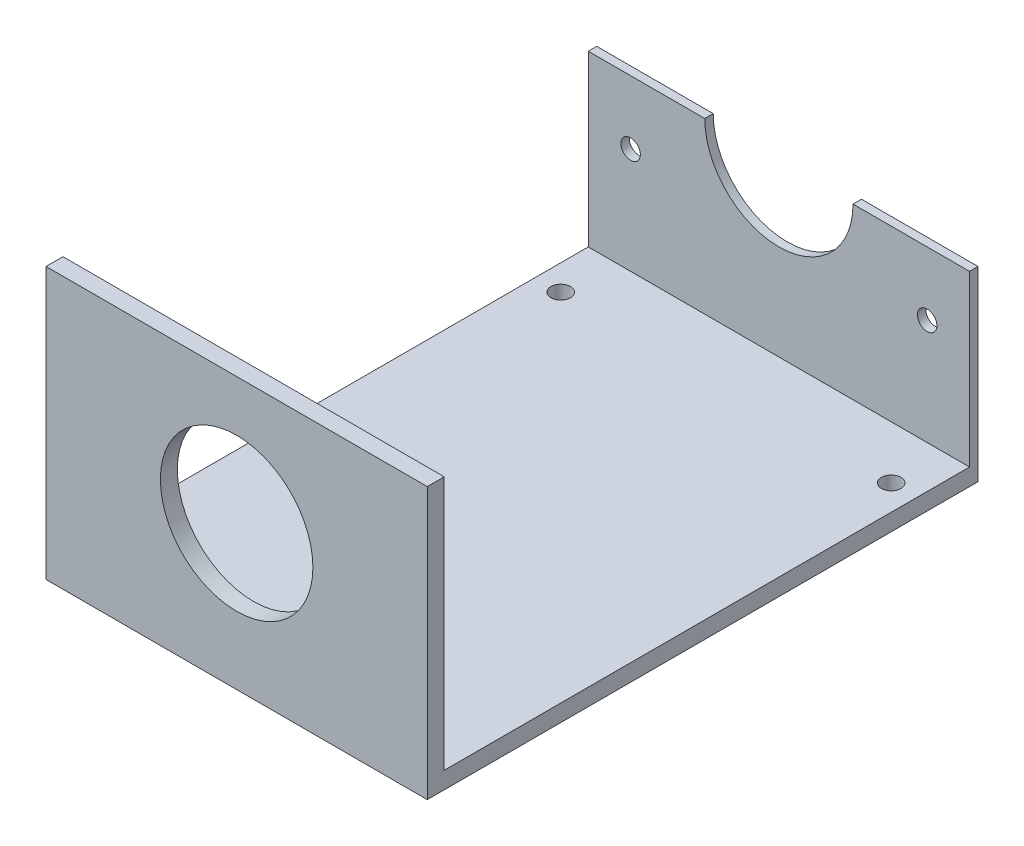
ISO-10303-21;
HEADER;
FILE_DESCRIPTION(('STEP AP214'),'2;1');
FILE_NAME('part.step','',(''),(''),'','','');
FILE_SCHEMA(('AUTOMOTIVE_DESIGN { 1 0 10303 214 1 1 1 1 }'));
ENDSEC;
DATA;
#1=APPLICATION_CONTEXT('core data for automotive mechanical design processes');
#2=APPLICATION_PROTOCOL_DEFINITION('international standard','automotive_design',2000,#1);
#3=PRODUCT_CONTEXT('',#1,'mechanical');
#4=PRODUCT('Part','Part','',(#3));
#5=PRODUCT_RELATED_PRODUCT_CATEGORY('part','',(#4));
#6=PRODUCT_DEFINITION_FORMATION('','',#4);
#7=PRODUCT_DEFINITION_CONTEXT('part definition',#1,'design');
#8=PRODUCT_DEFINITION('design','',#6,#7);
#9=PRODUCT_DEFINITION_SHAPE('','',#8);
#10=(LENGTH_UNIT() NAMED_UNIT(*) SI_UNIT(.MILLI.,.METRE.));
#11=(NAMED_UNIT(*) PLANE_ANGLE_UNIT() SI_UNIT($,.RADIAN.));
#12=(NAMED_UNIT(*) SI_UNIT($,.STERADIAN.) SOLID_ANGLE_UNIT());
#13=UNCERTAINTY_MEASURE_WITH_UNIT(LENGTH_MEASURE(1.E-05),#10,'distance_accuracy_value','');
#14=(GEOMETRIC_REPRESENTATION_CONTEXT(3) GLOBAL_UNCERTAINTY_ASSIGNED_CONTEXT((#13)) GLOBAL_UNIT_ASSIGNED_CONTEXT((#10,
#11,#12)) REPRESENTATION_CONTEXT('',''));
#15=CARTESIAN_POINT('',(0.,0.,0.));
#16=DIRECTION('',(0.,0.,1.));
#17=DIRECTION('',(1.,0.,0.));
#18=AXIS2_PLACEMENT_3D('',#15,#16,#17);
#19=CARTESIAN_POINT('',(0.,0.,128.));
#20=DIRECTION('',(0.,-1.,0.));
#21=DIRECTION('',(0.,0.,-1.));
#22=AXIS2_PLACEMENT_3D('',#19,#20,#21);
#23=PLANE('',#22);
#24=CARTESIAN_POINT('',(84.,0.,12.5));
#25=DIRECTION('',(0.,1.,0.));
#26=DIRECTION('',(0.,0.,1.));
#27=AXIS2_PLACEMENT_3D('',#24,#25,#26);
#28=CIRCLE('',#27,2.29999999999999);
#29=CARTESIAN_POINT('',(84.,0.,14.8));
#30=VERTEX_POINT('',#29);
#31=EDGE_CURVE('E175',#30,#30,#28,.T.);
#32=ORIENTED_EDGE('',*,*,#31,.F.);
#33=EDGE_LOOP('',(#32));
#34=FACE_BOUND('',#33,.T.);
#35=CARTESIAN_POINT('',(6.,0.,12.5));
#36=DIRECTION('',(0.,1.,0.));
#37=DIRECTION('',(0.,0.,1.));
#38=AXIS2_PLACEMENT_3D('',#35,#36,#37);
#39=CIRCLE('',#38,2.3);
#40=CARTESIAN_POINT('',(6.,0.,14.8));
#41=VERTEX_POINT('',#40);
#42=EDGE_CURVE('E182',#41,#41,#39,.T.);
#43=ORIENTED_EDGE('',*,*,#42,.F.);
#44=EDGE_LOOP('',(#43));
#45=FACE_BOUND('',#44,.T.);
#46=DIRECTION('',(-1.,0.,0.));
#47=VECTOR('',#46,1.);
#48=CARTESIAN_POINT('',(0.,0.,124.));
#49=LINE('',#48,#47);
#50=CARTESIAN_POINT('',(90.,0.,124.));
#51=VERTEX_POINT('',#50);
#52=CARTESIAN_POINT('',(0.,0.,124.));
#53=VERTEX_POINT('',#52);
#54=EDGE_CURVE('E170',#51,#53,#49,.T.);
#55=ORIENTED_EDGE('',*,*,#54,.F.);
#56=DIRECTION('',(0.,0.,-1.));
#57=VECTOR('',#56,1.);
#58=CARTESIAN_POINT('',(90.,0.,128.));
#59=LINE('',#58,#57);
#60=CARTESIAN_POINT('',(90.,0.,0.));
#61=VERTEX_POINT('',#60);
#62=EDGE_CURVE('E57',#51,#61,#59,.T.);
#63=ORIENTED_EDGE('',*,*,#62,.T.);
#64=DIRECTION('',(-1.,0.,0.));
#65=VECTOR('',#64,1.);
#66=CARTESIAN_POINT('',(0.,0.,0.));
#67=LINE('',#66,#65);
#68=CARTESIAN_POINT('',(0.,0.,0.));
#69=VERTEX_POINT('',#68);
#70=EDGE_CURVE('E220',#61,#69,#67,.T.);
#71=ORIENTED_EDGE('',*,*,#70,.T.);
#72=DIRECTION('',(0.,0.,-1.));
#73=VECTOR('',#72,1.);
#74=CARTESIAN_POINT('',(0.,0.,128.));
#75=LINE('',#74,#73);
#76=EDGE_CURVE('E233',#53,#69,#75,.T.);
#77=ORIENTED_EDGE('',*,*,#76,.F.);
#78=EDGE_LOOP('',(#55,#63,#71,#77));
#79=FACE_BOUND('',#78,.T.);
#80=ADVANCED_FACE('F39',(#34,#45,#79),#23,.F.);
#81=CARTESIAN_POINT('',(45.,40.,0.));
#82=DIRECTION('',(0.,0.,-1.));
#83=DIRECTION('',(-1.,0.,0.));
#84=AXIS2_PLACEMENT_3D('',#81,#82,#83);
#85=PLANE('',#84);
#86=CARTESIAN_POINT('',(10.,25.,0.));
#87=DIRECTION('',(0.,0.,1.));
#88=DIRECTION('',(1.,0.,0.));
#89=AXIS2_PLACEMENT_3D('',#86,#87,#88);
#90=CIRCLE('',#89,2.3);
#91=CARTESIAN_POINT('',(12.3,25.,0.));
#92=VERTEX_POINT('',#91);
#93=EDGE_CURVE('E246',#92,#92,#90,.T.);
#94=ORIENTED_EDGE('',*,*,#93,.F.);
#95=EDGE_LOOP('',(#94));
#96=FACE_BOUND('',#95,.T.);
#97=CARTESIAN_POINT('',(80.,25.,0.));
#98=DIRECTION('',(0.,0.,1.));
#99=DIRECTION('',(1.,0.,0.));
#100=AXIS2_PLACEMENT_3D('',#97,#98,#99);
#101=CIRCLE('',#100,2.29999999999999);
#102=CARTESIAN_POINT('',(82.3,25.,0.));
#103=VERTEX_POINT('',#102);
#104=EDGE_CURVE('E241',#103,#103,#101,.T.);
#105=ORIENTED_EDGE('',*,*,#104,.F.);
#106=EDGE_LOOP('',(#105));
#107=FACE_BOUND('',#106,.T.);
#108=ORIENTED_EDGE('',*,*,#70,.F.);
#109=DIRECTION('',(0.,1.,0.));
#110=VECTOR('',#109,1.);
#111=CARTESIAN_POINT('',(90.,40.,0.));
#112=LINE('',#111,#110);
#113=CARTESIAN_POINT('',(90.,40.,0.));
#114=VERTEX_POINT('',#113);
#115=EDGE_CURVE('E141',#61,#114,#112,.T.);
#116=ORIENTED_EDGE('',*,*,#115,.T.);
#117=DIRECTION('',(-1.,0.,0.));
#118=VECTOR('',#117,1.);
#119=CARTESIAN_POINT('',(90.,40.,0.));
#120=LINE('',#119,#118);
#121=CARTESIAN_POINT('',(62.5,40.,0.));
#122=VERTEX_POINT('',#121);
#123=EDGE_CURVE('E144',#114,#122,#120,.T.);
#124=ORIENTED_EDGE('',*,*,#123,.T.);
#125=CARTESIAN_POINT('',(45.,40.,0.));
#126=DIRECTION('',(0.,0.,-1.));
#127=DIRECTION('',(-1.,0.,0.));
#128=AXIS2_PLACEMENT_3D('',#125,#126,#127);
#129=CIRCLE('',#128,17.5);
#130=CARTESIAN_POINT('',(27.5,40.,0.));
#131=VERTEX_POINT('',#130);
#132=EDGE_CURVE('E113',#122,#131,#129,.T.);
#133=ORIENTED_EDGE('',*,*,#132,.T.);
#134=DIRECTION('',(-1.,0.,0.));
#135=VECTOR('',#134,1.);
#136=CARTESIAN_POINT('',(0.,40.,0.));
#137=LINE('',#136,#135);
#138=CARTESIAN_POINT('',(0.,40.,0.));
#139=VERTEX_POINT('',#138);
#140=EDGE_CURVE('E150',#131,#139,#137,.T.);
#141=ORIENTED_EDGE('',*,*,#140,.T.);
#142=DIRECTION('',(0.,-1.,0.));
#143=VECTOR('',#142,1.);
#144=CARTESIAN_POINT('',(0.,0.,0.));
#145=LINE('',#144,#143);
#146=EDGE_CURVE('E153',#139,#69,#145,.T.);
#147=ORIENTED_EDGE('',*,*,#146,.T.);
#148=EDGE_LOOP('',(#108,#116,#124,#133,#141,#147));
#149=FACE_BOUND('',#148,.T.);
#150=ADVANCED_FACE('F266',(#96,#107,#149),#85,.F.);
#151=CARTESIAN_POINT('',(0.,0.,-2.));
#152=DIRECTION('',(-1.,0.,0.));
#153=DIRECTION('',(0.,0.,1.));
#154=AXIS2_PLACEMENT_3D('',#151,#152,#153);
#155=PLANE('',#154);
#156=ORIENTED_EDGE('',*,*,#146,.F.);
#157=DIRECTION('',(0.,0.,1.));
#158=VECTOR('',#157,1.);
#159=CARTESIAN_POINT('',(0.,40.,-2.));
#160=LINE('',#159,#158);
#161=CARTESIAN_POINT('',(0.,40.,-2.));
#162=VERTEX_POINT('',#161);
#163=EDGE_CURVE('E11',#162,#139,#160,.T.);
#164=ORIENTED_EDGE('',*,*,#163,.F.);
#165=DIRECTION('',(0.,-1.,0.));
#166=VECTOR('',#165,1.);
#167=CARTESIAN_POINT('',(0.,0.,-2.));
#168=LINE('',#167,#166);
#169=CARTESIAN_POINT('',(0.,-4.,-2.));
#170=VERTEX_POINT('',#169);
#171=EDGE_CURVE('E66',#162,#170,#168,.T.);
#172=ORIENTED_EDGE('',*,*,#171,.T.);
#173=DIRECTION('',(0.,0.,1.));
#174=VECTOR('',#173,1.);
#175=CARTESIAN_POINT('',(0.,-4.,-2.));
#176=LINE('',#175,#174);
#177=CARTESIAN_POINT('',(0.,-4.,128.));
#178=VERTEX_POINT('',#177);
#179=EDGE_CURVE('E95',#170,#178,#176,.T.);
#180=ORIENTED_EDGE('',*,*,#179,.T.);
#181=DIRECTION('',(0.,-1.,0.));
#182=VECTOR('',#181,1.);
#183=CARTESIAN_POINT('',(0.,-4.,128.));
#184=LINE('',#183,#182);
#185=CARTESIAN_POINT('',(0.,60.,128.));
#186=VERTEX_POINT('',#185);
#187=EDGE_CURVE('E229',#186,#178,#184,.T.);
#188=ORIENTED_EDGE('',*,*,#187,.F.);
#189=DIRECTION('',(0.,0.,1.));
#190=VECTOR('',#189,1.);
#191=CARTESIAN_POINT('',(0.,60.,128.));
#192=LINE('',#191,#190);
#193=CARTESIAN_POINT('',(0.,60.,124.));
#194=VERTEX_POINT('',#193);
#195=EDGE_CURVE('E205',#194,#186,#192,.T.);
#196=ORIENTED_EDGE('',*,*,#195,.F.);
#197=DIRECTION('',(0.,-1.,0.));
#198=VECTOR('',#197,1.);
#199=CARTESIAN_POINT('',(0.,60.,124.));
#200=LINE('',#199,#198);
#201=EDGE_CURVE('E209',#194,#53,#200,.T.);
#202=ORIENTED_EDGE('',*,*,#201,.T.);
#203=ORIENTED_EDGE('',*,*,#76,.T.);
#204=EDGE_LOOP('',(#156,#164,#172,#180,#188,#196,#202,#203));
#205=FACE_BOUND('',#204,.T.);
#206=ADVANCED_FACE('F262',(#205),#155,.T.);
#207=CARTESIAN_POINT('',(0.,40.,-2.));
#208=DIRECTION('',(0.,1.,0.));
#209=DIRECTION('',(0.,0.,1.));
#210=AXIS2_PLACEMENT_3D('',#207,#208,#209);
#211=PLANE('',#210);
#212=ORIENTED_EDGE('',*,*,#140,.F.);
#213=DIRECTION('',(0.,0.,1.));
#214=VECTOR('',#213,1.);
#215=CARTESIAN_POINT('',(27.5,40.,-2.));
#216=LINE('',#215,#214);
#217=CARTESIAN_POINT('',(27.5,40.,-2.));
#218=VERTEX_POINT('',#217);
#219=EDGE_CURVE('E49',#218,#131,#216,.T.);
#220=ORIENTED_EDGE('',*,*,#219,.F.);
#221=DIRECTION('',(-1.,0.,0.));
#222=VECTOR('',#221,1.);
#223=CARTESIAN_POINT('',(0.,40.,-2.));
#224=LINE('',#223,#222);
#225=EDGE_CURVE('E125',#218,#162,#224,.T.);
#226=ORIENTED_EDGE('',*,*,#225,.T.);
#227=ORIENTED_EDGE('',*,*,#163,.T.);
#228=EDGE_LOOP('',(#212,#220,#226,#227));
#229=FACE_BOUND('',#228,.T.);
#230=ADVANCED_FACE('F264',(#229),#211,.T.);
#231=CARTESIAN_POINT('',(45.,40.,-2.));
#232=DIRECTION('',(0.,0.,1.));
#233=DIRECTION('',(1.,0.,0.));
#234=AXIS2_PLACEMENT_3D('',#231,#232,#233);
#235=CYLINDRICAL_SURFACE('',#234,17.5);
#236=ORIENTED_EDGE('',*,*,#132,.F.);
#237=DIRECTION('',(0.,0.,1.));
#238=VECTOR('',#237,1.);
#239=CARTESIAN_POINT('',(62.5,40.,-2.));
#240=LINE('',#239,#238);
#241=CARTESIAN_POINT('',(62.5,40.,-2.));
#242=VERTEX_POINT('',#241);
#243=EDGE_CURVE('E108',#242,#122,#240,.T.);
#244=ORIENTED_EDGE('',*,*,#243,.F.);
#245=CARTESIAN_POINT('',(45.,40.,-2.));
#246=DIRECTION('',(0.,0.,-1.));
#247=DIRECTION('',(-1.,0.,0.));
#248=AXIS2_PLACEMENT_3D('',#245,#246,#247);
#249=CIRCLE('',#248,17.5);
#250=EDGE_CURVE('E111',#242,#218,#249,.T.);
#251=ORIENTED_EDGE('',*,*,#250,.T.);
#252=ORIENTED_EDGE('',*,*,#219,.T.);
#253=EDGE_LOOP('',(#236,#244,#251,#252));
#254=FACE_BOUND('',#253,.T.);
#255=ADVANCED_FACE('F110',(#254),#235,.F.);
#256=CARTESIAN_POINT('',(90.,40.,-2.));
#257=DIRECTION('',(0.,1.,0.));
#258=DIRECTION('',(0.,0.,1.));
#259=AXIS2_PLACEMENT_3D('',#256,#257,#258);
#260=PLANE('',#259);
#261=ORIENTED_EDGE('',*,*,#123,.F.);
#262=DIRECTION('',(0.,0.,1.));
#263=VECTOR('',#262,1.);
#264=CARTESIAN_POINT('',(90.,40.,-2.));
#265=LINE('',#264,#263);
#266=CARTESIAN_POINT('',(90.,40.,-2.));
#267=VERTEX_POINT('',#266);
#268=EDGE_CURVE('E119',#267,#114,#265,.T.);
#269=ORIENTED_EDGE('',*,*,#268,.F.);
#270=DIRECTION('',(-1.,0.,0.));
#271=VECTOR('',#270,1.);
#272=CARTESIAN_POINT('',(90.,40.,-2.));
#273=LINE('',#272,#271);
#274=EDGE_CURVE('E124',#267,#242,#273,.T.);
#275=ORIENTED_EDGE('',*,*,#274,.T.);
#276=ORIENTED_EDGE('',*,*,#243,.T.);
#277=EDGE_LOOP('',(#261,#269,#275,#276));
#278=FACE_BOUND('',#277,.T.);
#279=ADVANCED_FACE('F129',(#278),#260,.T.);
#280=CARTESIAN_POINT('',(90.,40.,-2.));
#281=DIRECTION('',(1.,0.,0.));
#282=DIRECTION('',(0.,0.,-1.));
#283=AXIS2_PLACEMENT_3D('',#280,#281,#282);
#284=PLANE('',#283);
#285=ORIENTED_EDGE('',*,*,#115,.F.);
#286=ORIENTED_EDGE('',*,*,#62,.F.);
#287=DIRECTION('',(0.,-1.,0.));
#288=VECTOR('',#287,1.);
#289=CARTESIAN_POINT('',(90.,60.,124.));
#290=LINE('',#289,#288);
#291=CARTESIAN_POINT('',(90.,60.,124.));
#292=VERTEX_POINT('',#291);
#293=EDGE_CURVE('E216',#292,#51,#290,.T.);
#294=ORIENTED_EDGE('',*,*,#293,.F.);
#295=DIRECTION('',(0.,0.,-1.));
#296=VECTOR('',#295,1.);
#297=CARTESIAN_POINT('',(90.,60.,124.));
#298=LINE('',#297,#296);
#299=CARTESIAN_POINT('',(90.,60.,128.));
#300=VERTEX_POINT('',#299);
#301=EDGE_CURVE('E197',#300,#292,#298,.T.);
#302=ORIENTED_EDGE('',*,*,#301,.F.);
#303=DIRECTION('',(0.,1.,0.));
#304=VECTOR('',#303,1.);
#305=CARTESIAN_POINT('',(90.,0.,128.));
#306=LINE('',#305,#304);
#307=CARTESIAN_POINT('',(90.,-4.,128.));
#308=VERTEX_POINT('',#307);
#309=EDGE_CURVE('E225',#308,#300,#306,.T.);
#310=ORIENTED_EDGE('',*,*,#309,.F.);
#311=DIRECTION('',(0.,0.,1.));
#312=VECTOR('',#311,1.);
#313=CARTESIAN_POINT('',(90.,-4.,-2.));
#314=LINE('',#313,#312);
#315=CARTESIAN_POINT('',(90.,-4.,-2.));
#316=VERTEX_POINT('',#315);
#317=EDGE_CURVE('E161',#316,#308,#314,.T.);
#318=ORIENTED_EDGE('',*,*,#317,.F.);
#319=DIRECTION('',(0.,1.,0.));
#320=VECTOR('',#319,1.);
#321=CARTESIAN_POINT('',(90.,0.,-2.));
#322=LINE('',#321,#320);
#323=EDGE_CURVE('E132',#316,#267,#322,.T.);
#324=ORIENTED_EDGE('',*,*,#323,.T.);
#325=ORIENTED_EDGE('',*,*,#268,.T.);
#326=EDGE_LOOP('',(#285,#286,#294,#302,#310,#318,#324,#325));
#327=FACE_BOUND('',#326,.T.);
#328=ADVANCED_FACE('F269',(#327),#284,.T.);
#329=CARTESIAN_POINT('',(90.,-4.,-2.));
#330=DIRECTION('',(0.,-1.,0.));
#331=DIRECTION('',(0.,0.,-1.));
#332=AXIS2_PLACEMENT_3D('',#329,#330,#331);
#333=PLANE('',#332);
#334=CARTESIAN_POINT('',(84.,-4.,12.5));
#335=DIRECTION('',(0.,-1.,0.));
#336=DIRECTION('',(0.,0.,-1.));
#337=AXIS2_PLACEMENT_3D('',#334,#335,#336);
#338=CIRCLE('',#337,2.29999999999999);
#339=CARTESIAN_POINT('',(84.,-4.,10.2));
#340=VERTEX_POINT('',#339);
#341=EDGE_CURVE('E43',#340,#340,#338,.T.);
#342=ORIENTED_EDGE('',*,*,#341,.F.);
#343=EDGE_LOOP('',(#342));
#344=FACE_BOUND('',#343,.T.);
#345=CARTESIAN_POINT('',(6.,-4.,12.5));
#346=DIRECTION('',(0.,-1.,0.));
#347=DIRECTION('',(0.,0.,-1.));
#348=AXIS2_PLACEMENT_3D('',#345,#346,#347);
#349=CIRCLE('',#348,2.3);
#350=CARTESIAN_POINT('',(6.,-4.,10.2));
#351=VERTEX_POINT('',#350);
#352=EDGE_CURVE('E172',#351,#351,#349,.T.);
#353=ORIENTED_EDGE('',*,*,#352,.F.);
#354=EDGE_LOOP('',(#353));
#355=FACE_BOUND('',#354,.T.);
#356=ORIENTED_EDGE('',*,*,#317,.T.);
#357=DIRECTION('',(1.,0.,0.));
#358=VECTOR('',#357,1.);
#359=CARTESIAN_POINT('',(90.,-4.,128.));
#360=LINE('',#359,#358);
#361=EDGE_CURVE('E221',#178,#308,#360,.T.);
#362=ORIENTED_EDGE('',*,*,#361,.F.);
#363=ORIENTED_EDGE('',*,*,#179,.F.);
#364=DIRECTION('',(1.,0.,0.));
#365=VECTOR('',#364,1.);
#366=CARTESIAN_POINT('',(90.,-4.,-2.));
#367=LINE('',#366,#365);
#368=EDGE_CURVE('E135',#170,#316,#367,.T.);
#369=ORIENTED_EDGE('',*,*,#368,.T.);
#370=EDGE_LOOP('',(#356,#362,#363,#369));
#371=FACE_BOUND('',#370,.T.);
#372=ADVANCED_FACE('F41',(#344,#355,#371),#333,.T.);
#373=CARTESIAN_POINT('',(45.,40.,-2.));
#374=DIRECTION('',(0.,0.,-1.));
#375=DIRECTION('',(-1.,0.,0.));
#376=AXIS2_PLACEMENT_3D('',#373,#374,#375);
#377=PLANE('',#376);
#378=CARTESIAN_POINT('',(80.,25.,-2.));
#379=DIRECTION('',(0.,0.,1.));
#380=DIRECTION('',(1.,0.,0.));
#381=AXIS2_PLACEMENT_3D('',#378,#379,#380);
#382=CIRCLE('',#381,2.29999999999999);
#383=CARTESIAN_POINT('',(82.3,25.,-2.));
#384=VERTEX_POINT('',#383);
#385=EDGE_CURVE('E242',#384,#384,#382,.T.);
#386=ORIENTED_EDGE('',*,*,#385,.T.);
#387=EDGE_LOOP('',(#386));
#388=FACE_BOUND('',#387,.T.);
#389=CARTESIAN_POINT('',(10.,25.,-2.));
#390=DIRECTION('',(0.,0.,1.));
#391=DIRECTION('',(1.,0.,0.));
#392=AXIS2_PLACEMENT_3D('',#389,#390,#391);
#393=CIRCLE('',#392,2.3);
#394=CARTESIAN_POINT('',(12.3,25.,-2.));
#395=VERTEX_POINT('',#394);
#396=EDGE_CURVE('E145',#395,#395,#393,.T.);
#397=ORIENTED_EDGE('',*,*,#396,.T.);
#398=EDGE_LOOP('',(#397));
#399=FACE_BOUND('',#398,.T.);
#400=ORIENTED_EDGE('',*,*,#171,.F.);
#401=ORIENTED_EDGE('',*,*,#225,.F.);
#402=ORIENTED_EDGE('',*,*,#250,.F.);
#403=ORIENTED_EDGE('',*,*,#274,.F.);
#404=ORIENTED_EDGE('',*,*,#323,.F.);
#405=ORIENTED_EDGE('',*,*,#368,.F.);
#406=EDGE_LOOP('',(#400,#401,#402,#403,#404,#405));
#407=FACE_BOUND('',#406,.T.);
#408=ADVANCED_FACE('F122',(#388,#399,#407),#377,.T.);
#409=CARTESIAN_POINT('',(10.,25.,-2.));
#410=DIRECTION('',(0.,0.,1.));
#411=DIRECTION('',(1.,0.,0.));
#412=AXIS2_PLACEMENT_3D('',#409,#410,#411);
#413=CYLINDRICAL_SURFACE('',#412,2.3);
#414=ORIENTED_EDGE('',*,*,#396,.F.);
#415=EDGE_LOOP('',(#414));
#416=FACE_BOUND('',#415,.T.);
#417=ORIENTED_EDGE('',*,*,#93,.T.);
#418=EDGE_LOOP('',(#417));
#419=FACE_BOUND('',#418,.T.);
#420=ADVANCED_FACE('F311',(#416,#419),#413,.F.);
#421=CARTESIAN_POINT('',(80.,25.,-2.));
#422=DIRECTION('',(0.,0.,1.));
#423=DIRECTION('',(1.,0.,0.));
#424=AXIS2_PLACEMENT_3D('',#421,#422,#423);
#425=CYLINDRICAL_SURFACE('',#424,2.29999999999999);
#426=ORIENTED_EDGE('',*,*,#385,.F.);
#427=EDGE_LOOP('',(#426));
#428=FACE_BOUND('',#427,.T.);
#429=ORIENTED_EDGE('',*,*,#104,.T.);
#430=EDGE_LOOP('',(#429));
#431=FACE_BOUND('',#430,.T.);
#432=ADVANCED_FACE('F308',(#428,#431),#425,.F.);
#433=CARTESIAN_POINT('',(0.,0.,128.));
#434=DIRECTION('',(0.,0.,-1.));
#435=DIRECTION('',(-1.,0.,0.));
#436=AXIS2_PLACEMENT_3D('',#433,#434,#435);
#437=PLANE('',#436);
#438=CARTESIAN_POINT('',(45.,30.,128.));
#439=DIRECTION('',(0.,0.,1.));
#440=DIRECTION('',(1.,0.,0.));
#441=AXIS2_PLACEMENT_3D('',#438,#439,#440);
#442=CIRCLE('',#441,18.);
#443=CARTESIAN_POINT('',(63.,30.,128.));
#444=VERTEX_POINT('',#443);
#445=EDGE_CURVE('E171',#444,#444,#442,.T.);
#446=ORIENTED_EDGE('',*,*,#445,.F.);
#447=EDGE_LOOP('',(#446));
#448=FACE_BOUND('',#447,.T.);
#449=ORIENTED_EDGE('',*,*,#361,.T.);
#450=ORIENTED_EDGE('',*,*,#309,.T.);
#451=DIRECTION('',(1.,0.,0.));
#452=VECTOR('',#451,1.);
#453=CARTESIAN_POINT('',(90.,60.,128.));
#454=LINE('',#453,#452);
#455=EDGE_CURVE('E193',#186,#300,#454,.T.);
#456=ORIENTED_EDGE('',*,*,#455,.F.);
#457=ORIENTED_EDGE('',*,*,#187,.T.);
#458=EDGE_LOOP('',(#449,#450,#456,#457));
#459=FACE_BOUND('',#458,.T.);
#460=ADVANCED_FACE('F276',(#448,#459),#437,.F.);
#461=CARTESIAN_POINT('',(0.,60.,124.));
#462=DIRECTION('',(0.,0.,1.));
#463=DIRECTION('',(1.,0.,0.));
#464=AXIS2_PLACEMENT_3D('',#461,#462,#463);
#465=PLANE('',#464);
#466=CARTESIAN_POINT('',(45.,30.,124.));
#467=DIRECTION('',(0.,0.,1.));
#468=DIRECTION('',(1.,0.,0.));
#469=AXIS2_PLACEMENT_3D('',#466,#467,#468);
#470=CIRCLE('',#469,18.);
#471=CARTESIAN_POINT('',(63.,30.,124.));
#472=VERTEX_POINT('',#471);
#473=EDGE_CURVE('E167',#472,#472,#470,.T.);
#474=ORIENTED_EDGE('',*,*,#473,.T.);
#475=EDGE_LOOP('',(#474));
#476=FACE_BOUND('',#475,.T.);
#477=ORIENTED_EDGE('',*,*,#54,.T.);
#478=ORIENTED_EDGE('',*,*,#201,.F.);
#479=DIRECTION('',(-1.,0.,0.));
#480=VECTOR('',#479,1.);
#481=CARTESIAN_POINT('',(0.,60.,124.));
#482=LINE('',#481,#480);
#483=EDGE_CURVE('E201',#292,#194,#482,.T.);
#484=ORIENTED_EDGE('',*,*,#483,.F.);
#485=ORIENTED_EDGE('',*,*,#293,.T.);
#486=EDGE_LOOP('',(#477,#478,#484,#485));
#487=FACE_BOUND('',#486,.T.);
#488=ADVANCED_FACE('F293',(#476,#487),#465,.F.);
#489=CARTESIAN_POINT('',(0.,60.,0.));
#490=DIRECTION('',(0.,-1.,0.));
#491=DIRECTION('',(0.,0.,-1.));
#492=AXIS2_PLACEMENT_3D('',#489,#490,#491);
#493=PLANE('',#492);
#494=ORIENTED_EDGE('',*,*,#455,.T.);
#495=ORIENTED_EDGE('',*,*,#301,.T.);
#496=ORIENTED_EDGE('',*,*,#483,.T.);
#497=ORIENTED_EDGE('',*,*,#195,.T.);
#498=EDGE_LOOP('',(#494,#495,#496,#497));
#499=FACE_BOUND('',#498,.T.);
#500=ADVANCED_FACE('F289',(#499),#493,.F.);
#501=CARTESIAN_POINT('',(45.,30.,68.));
#502=DIRECTION('',(0.,0.,1.));
#503=DIRECTION('',(1.,0.,0.));
#504=AXIS2_PLACEMENT_3D('',#501,#502,#503);
#505=CYLINDRICAL_SURFACE('',#504,18.);
#506=ORIENTED_EDGE('',*,*,#445,.T.);
#507=EDGE_LOOP('',(#506));
#508=FACE_BOUND('',#507,.T.);
#509=ORIENTED_EDGE('',*,*,#473,.F.);
#510=EDGE_LOOP('',(#509));
#511=FACE_BOUND('',#510,.T.);
#512=ADVANCED_FACE('F343',(#508,#511),#505,.F.);
#513=CARTESIAN_POINT('',(6.,-60.,12.5));
#514=DIRECTION('',(0.,1.,0.));
#515=DIRECTION('',(0.,0.,1.));
#516=AXIS2_PLACEMENT_3D('',#513,#514,#515);
#517=CYLINDRICAL_SURFACE('',#516,2.3);
#518=ORIENTED_EDGE('',*,*,#352,.T.);
#519=EDGE_LOOP('',(#518));
#520=FACE_BOUND('',#519,.T.);
#521=ORIENTED_EDGE('',*,*,#42,.T.);
#522=EDGE_LOOP('',(#521));
#523=FACE_BOUND('',#522,.T.);
#524=ADVANCED_FACE('F338',(#520,#523),#517,.F.);
#525=CARTESIAN_POINT('',(84.,-60.,12.5));
#526=DIRECTION('',(0.,1.,0.));
#527=DIRECTION('',(0.,0.,1.));
#528=AXIS2_PLACEMENT_3D('',#525,#526,#527);
#529=CYLINDRICAL_SURFACE('',#528,2.29999999999999);
#530=ORIENTED_EDGE('',*,*,#341,.T.);
#531=EDGE_LOOP('',(#530));
#532=FACE_BOUND('',#531,.T.);
#533=ORIENTED_EDGE('',*,*,#31,.T.);
#534=EDGE_LOOP('',(#533));
#535=FACE_BOUND('',#534,.T.);
#536=ADVANCED_FACE('F336',(#532,#535),#529,.F.);
#537=CLOSED_SHELL('',(#80,#150,#206,#230,#255,#279,#328,#372,#408,#420,#432,#460,#488,#500,#512,
#524,#536));
#538=MANIFOLD_SOLID_BREP('B2',#537);
#539=ADVANCED_BREP_SHAPE_REPRESENTATION('',(#18,#538),#14);
#540=SHAPE_DEFINITION_REPRESENTATION(#9,#539);
ENDSEC;
END-ISO-10303-21;
